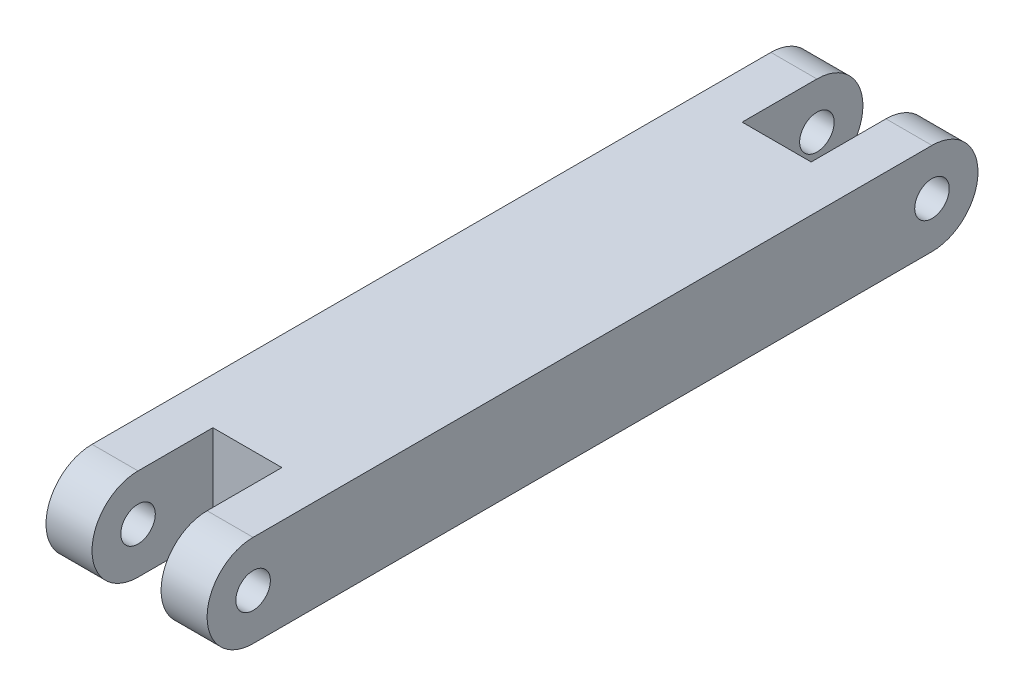
ISO-10303-21;
HEADER;
FILE_DESCRIPTION(('STEP AP214'),'2;1');
FILE_NAME('part.step','',(''),(''),'','','');
FILE_SCHEMA(('AUTOMOTIVE_DESIGN { 1 0 10303 214 1 1 1 1 }'));
ENDSEC;
DATA;
#1=APPLICATION_CONTEXT('core data for automotive mechanical design processes');
#2=APPLICATION_PROTOCOL_DEFINITION('international standard','automotive_design',2000,#1);
#3=PRODUCT_CONTEXT('',#1,'mechanical');
#4=PRODUCT('Part','Part','',(#3));
#5=PRODUCT_RELATED_PRODUCT_CATEGORY('part','',(#4));
#6=PRODUCT_DEFINITION_FORMATION('','',#4);
#7=PRODUCT_DEFINITION_CONTEXT('part definition',#1,'design');
#8=PRODUCT_DEFINITION('design','',#6,#7);
#9=PRODUCT_DEFINITION_SHAPE('','',#8);
#10=(LENGTH_UNIT() NAMED_UNIT(*) SI_UNIT(.MILLI.,.METRE.));
#11=(NAMED_UNIT(*) PLANE_ANGLE_UNIT() SI_UNIT($,.RADIAN.));
#12=(NAMED_UNIT(*) SI_UNIT($,.STERADIAN.) SOLID_ANGLE_UNIT());
#13=UNCERTAINTY_MEASURE_WITH_UNIT(LENGTH_MEASURE(1.E-05),#10,'distance_accuracy_value','');
#14=(GEOMETRIC_REPRESENTATION_CONTEXT(3) GLOBAL_UNCERTAINTY_ASSIGNED_CONTEXT((#13)) GLOBAL_UNIT_ASSIGNED_CONTEXT((#10,
#11,#12)) REPRESENTATION_CONTEXT('',''));
#15=CARTESIAN_POINT('',(0.,0.,0.));
#16=DIRECTION('',(0.,0.,1.));
#17=DIRECTION('',(1.,0.,0.));
#18=AXIS2_PLACEMENT_3D('',#15,#16,#17);
#19=CARTESIAN_POINT('',(4.,0.,29.5));
#20=DIRECTION('',(1.,0.,0.));
#21=DIRECTION('',(0.,0.,-1.));
#22=AXIS2_PLACEMENT_3D('',#19,#20,#21);
#23=PLANE('',#22);
#24=CARTESIAN_POINT('',(4.,0.,-29.5));
#25=DIRECTION('',(1.,0.,0.));
#26=DIRECTION('',(0.,0.,-1.));
#27=AXIS2_PLACEMENT_3D('',#24,#25,#26);
#28=CIRCLE('',#27,1.5);
#29=CARTESIAN_POINT('',(4.,0.,-31.));
#30=VERTEX_POINT('',#29);
#31=EDGE_CURVE('E175',#30,#30,#28,.T.);
#32=ORIENTED_EDGE('',*,*,#31,.F.);
#33=EDGE_LOOP('',(#32));
#34=FACE_BOUND('',#33,.T.);
#35=DIRECTION('',(0.,0.,1.));
#36=VECTOR('',#35,1.);
#37=CARTESIAN_POINT('',(4.,4.00000000000001,29.5));
#38=LINE('',#37,#36);
#39=CARTESIAN_POINT('',(4.,4.00000000000001,-29.5));
#40=VERTEX_POINT('',#39);
#41=CARTESIAN_POINT('',(4.,4.00000000000001,-23.));
#42=VERTEX_POINT('',#41);
#43=EDGE_CURVE('E57',#40,#42,#38,.T.);
#44=ORIENTED_EDGE('',*,*,#43,.T.);
#45=DIRECTION('',(0.,-1.,0.));
#46=VECTOR('',#45,1.);
#47=CARTESIAN_POINT('',(4.,4.00000000000001,-23.));
#48=LINE('',#47,#46);
#49=CARTESIAN_POINT('',(4.,-4.00000000000001,-23.));
#50=VERTEX_POINT('',#49);
#51=EDGE_CURVE('E150',#42,#50,#48,.T.);
#52=ORIENTED_EDGE('',*,*,#51,.T.);
#53=DIRECTION('',(0.,0.,-1.));
#54=VECTOR('',#53,1.);
#55=CARTESIAN_POINT('',(4.,-4.00000000000001,29.5));
#56=LINE('',#55,#54);
#57=CARTESIAN_POINT('',(4.,-4.00000000000001,-29.5));
#58=VERTEX_POINT('',#57);
#59=EDGE_CURVE('E190',#50,#58,#56,.T.);
#60=ORIENTED_EDGE('',*,*,#59,.T.);
#61=CARTESIAN_POINT('',(4.,0.,-29.5));
#62=DIRECTION('',(1.,0.,0.));
#63=DIRECTION('',(0.,0.,-1.));
#64=AXIS2_PLACEMENT_3D('',#61,#62,#63);
#65=CIRCLE('',#64,4.00000000000001);
#66=EDGE_CURVE('E194',#58,#40,#65,.T.);
#67=ORIENTED_EDGE('',*,*,#66,.T.);
#68=EDGE_LOOP('',(#44,#52,#60,#67));
#69=FACE_BOUND('',#68,.T.);
#70=ADVANCED_FACE('F34',(#34,#69),#23,.T.);
#71=DIRECTION('',(0.,-1.,0.));
#72=VECTOR('',#71,1.);
#73=CARTESIAN_POINT('',(4.,4.00000000000001,23.));
#74=LINE('',#73,#72);
#75=CARTESIAN_POINT('',(4.,4.00000000000001,23.));
#76=VERTEX_POINT('',#75);
#77=CARTESIAN_POINT('',(4.,-3.99999999999999,23.));
#78=VERTEX_POINT('',#77);
#79=EDGE_CURVE('E49',#76,#78,#74,.T.);
#80=ORIENTED_EDGE('',*,*,#79,.F.);
#81=CARTESIAN_POINT('',(4.,4.00000000000001,29.5));
#82=VERTEX_POINT('',#81);
#83=EDGE_CURVE('E196',#76,#82,#38,.T.);
#84=ORIENTED_EDGE('',*,*,#83,.T.);
#85=CARTESIAN_POINT('',(4.,0.,29.5));
#86=DIRECTION('',(1.,0.,0.));
#87=DIRECTION('',(0.,0.,-1.));
#88=AXIS2_PLACEMENT_3D('',#85,#86,#87);
#89=CIRCLE('',#88,4.00000000000001);
#90=CARTESIAN_POINT('',(4.,-4.00000000000001,29.5));
#91=VERTEX_POINT('',#90);
#92=EDGE_CURVE('E187',#82,#91,#89,.T.);
#93=ORIENTED_EDGE('',*,*,#92,.T.);
#94=EDGE_CURVE('E192',#91,#78,#56,.T.);
#95=ORIENTED_EDGE('',*,*,#94,.T.);
#96=EDGE_LOOP('',(#80,#84,#93,#95));
#97=FACE_BOUND('',#96,.T.);
#98=CARTESIAN_POINT('',(4.,0.,29.5));
#99=DIRECTION('',(1.,0.,0.));
#100=DIRECTION('',(0.,0.,-1.));
#101=AXIS2_PLACEMENT_3D('',#98,#99,#100);
#102=CIRCLE('',#101,1.5);
#103=CARTESIAN_POINT('',(4.,0.,28.));
#104=VERTEX_POINT('',#103);
#105=EDGE_CURVE('E181',#104,#104,#102,.T.);
#106=ORIENTED_EDGE('',*,*,#105,.F.);
#107=EDGE_LOOP('',(#106));
#108=FACE_BOUND('',#107,.T.);
#109=ADVANCED_FACE('F229',(#97,#108),#23,.T.);
#110=CARTESIAN_POINT('',(0.,0.,29.5));
#111=DIRECTION('',(1.,0.,0.));
#112=DIRECTION('',(0.,0.,-1.));
#113=AXIS2_PLACEMENT_3D('',#110,#111,#112);
#114=PLANE('',#113);
#115=CARTESIAN_POINT('',(0.,0.,29.5));
#116=DIRECTION('',(1.,0.,0.));
#117=DIRECTION('',(0.,0.,-1.));
#118=AXIS2_PLACEMENT_3D('',#115,#116,#117);
#119=CIRCLE('',#118,4.00000000000001);
#120=CARTESIAN_POINT('',(0.,4.00000000000001,29.5));
#121=VERTEX_POINT('',#120);
#122=CARTESIAN_POINT('',(0.,-4.00000000000001,29.5));
#123=VERTEX_POINT('',#122);
#124=EDGE_CURVE('E184',#121,#123,#119,.T.);
#125=ORIENTED_EDGE('',*,*,#124,.F.);
#126=DIRECTION('',(0.,0.,1.));
#127=VECTOR('',#126,1.);
#128=CARTESIAN_POINT('',(0.,4.00000000000001,29.5));
#129=LINE('',#128,#127);
#130=CARTESIAN_POINT('',(0.,4.00000000000001,-29.5));
#131=VERTEX_POINT('',#130);
#132=EDGE_CURVE('E191',#131,#121,#129,.T.);
#133=ORIENTED_EDGE('',*,*,#132,.F.);
#134=CARTESIAN_POINT('',(0.,0.,-29.5));
#135=DIRECTION('',(1.,0.,0.));
#136=DIRECTION('',(0.,0.,-1.));
#137=AXIS2_PLACEMENT_3D('',#134,#135,#136);
#138=CIRCLE('',#137,4.00000000000001);
#139=CARTESIAN_POINT('',(0.,-4.00000000000001,-29.5));
#140=VERTEX_POINT('',#139);
#141=EDGE_CURVE('E203',#140,#131,#138,.T.);
#142=ORIENTED_EDGE('',*,*,#141,.F.);
#143=DIRECTION('',(0.,0.,-1.));
#144=VECTOR('',#143,1.);
#145=CARTESIAN_POINT('',(0.,-4.00000000000001,29.5));
#146=LINE('',#145,#144);
#147=EDGE_CURVE('E201',#123,#140,#146,.T.);
#148=ORIENTED_EDGE('',*,*,#147,.F.);
#149=EDGE_LOOP('',(#125,#133,#142,#148));
#150=FACE_BOUND('',#149,.T.);
#151=CARTESIAN_POINT('',(0.,0.,29.5));
#152=DIRECTION('',(1.,0.,0.));
#153=DIRECTION('',(0.,0.,-1.));
#154=AXIS2_PLACEMENT_3D('',#151,#152,#153);
#155=CIRCLE('',#154,1.5);
#156=CARTESIAN_POINT('',(0.,0.,28.));
#157=VERTEX_POINT('',#156);
#158=EDGE_CURVE('E178',#157,#157,#155,.T.);
#159=ORIENTED_EDGE('',*,*,#158,.T.);
#160=EDGE_LOOP('',(#159));
#161=FACE_BOUND('',#160,.T.);
#162=CARTESIAN_POINT('',(0.,0.,-29.5));
#163=DIRECTION('',(1.,0.,0.));
#164=DIRECTION('',(0.,0.,-1.));
#165=AXIS2_PLACEMENT_3D('',#162,#163,#164);
#166=CIRCLE('',#165,1.5);
#167=CARTESIAN_POINT('',(0.,0.,-31.));
#168=VERTEX_POINT('',#167);
#169=EDGE_CURVE('E168',#168,#168,#166,.T.);
#170=ORIENTED_EDGE('',*,*,#169,.T.);
#171=EDGE_LOOP('',(#170));
#172=FACE_BOUND('',#171,.T.);
#173=ADVANCED_FACE('F221',(#150,#161,#172),#114,.F.);
#174=CARTESIAN_POINT('',(4.,0.,29.5));
#175=DIRECTION('',(-1.,0.,0.));
#176=DIRECTION('',(0.,0.,1.));
#177=AXIS2_PLACEMENT_3D('',#174,#175,#176);
#178=CYLINDRICAL_SURFACE('',#177,4.00000000000001);
#179=ORIENTED_EDGE('',*,*,#124,.T.);
#180=DIRECTION('',(-1.,0.,0.));
#181=VECTOR('',#180,1.);
#182=CARTESIAN_POINT('',(4.,-4.00000000000001,29.5));
#183=LINE('',#182,#181);
#184=EDGE_CURVE('E11',#91,#123,#183,.T.);
#185=ORIENTED_EDGE('',*,*,#184,.F.);
#186=ORIENTED_EDGE('',*,*,#92,.F.);
#187=DIRECTION('',(-1.,0.,0.));
#188=VECTOR('',#187,1.);
#189=CARTESIAN_POINT('',(4.,4.00000000000001,29.5));
#190=LINE('',#189,#188);
#191=EDGE_CURVE('E198',#82,#121,#190,.T.);
#192=ORIENTED_EDGE('',*,*,#191,.T.);
#193=EDGE_LOOP('',(#179,#185,#186,#192));
#194=FACE_BOUND('',#193,.T.);
#195=ADVANCED_FACE('F36',(#194),#178,.T.);
#196=CARTESIAN_POINT('',(4.,-4.00000000000001,29.5));
#197=DIRECTION('',(0.,1.,0.));
#198=DIRECTION('',(0.,0.,1.));
#199=AXIS2_PLACEMENT_3D('',#196,#197,#198);
#200=PLANE('',#199);
#201=ORIENTED_EDGE('',*,*,#147,.T.);
#202=DIRECTION('',(-1.,0.,0.));
#203=VECTOR('',#202,1.);
#204=CARTESIAN_POINT('',(4.,-4.00000000000001,-29.5));
#205=LINE('',#204,#203);
#206=EDGE_CURVE('E42',#58,#140,#205,.T.);
#207=ORIENTED_EDGE('',*,*,#206,.F.);
#208=ORIENTED_EDGE('',*,*,#59,.F.);
#209=DIRECTION('',(1.,0.,0.));
#210=VECTOR('',#209,1.);
#211=CARTESIAN_POINT('',(4.,-3.99999999999999,-23.));
#212=LINE('',#211,#210);
#213=CARTESIAN_POINT('',(10.,-3.99999999999997,-23.));
#214=VERTEX_POINT('',#213);
#215=EDGE_CURVE('E152',#50,#214,#212,.T.);
#216=ORIENTED_EDGE('',*,*,#215,.T.);
#217=DIRECTION('',(0.,0.,-1.));
#218=VECTOR('',#217,1.);
#219=CARTESIAN_POINT('',(10.,-3.99999999999998,29.5));
#220=LINE('',#219,#218);
#221=CARTESIAN_POINT('',(10.,-3.99999999999999,-29.5));
#222=VERTEX_POINT('',#221);
#223=EDGE_CURVE('E241',#214,#222,#220,.T.);
#224=ORIENTED_EDGE('',*,*,#223,.T.);
#225=DIRECTION('',(-1.,0.,0.));
#226=VECTOR('',#225,1.);
#227=CARTESIAN_POINT('',(14.,-3.99999999999998,-29.5));
#228=LINE('',#227,#226);
#229=CARTESIAN_POINT('',(14.,-3.99999999999998,-29.5));
#230=VERTEX_POINT('',#229);
#231=EDGE_CURVE('E131',#230,#222,#228,.T.);
#232=ORIENTED_EDGE('',*,*,#231,.F.);
#233=DIRECTION('',(0.,0.,-1.));
#234=VECTOR('',#233,1.);
#235=CARTESIAN_POINT('',(14.,-3.99999999999998,29.5));
#236=LINE('',#235,#234);
#237=CARTESIAN_POINT('',(14.,-3.99999999999998,29.5));
#238=VERTEX_POINT('',#237);
#239=EDGE_CURVE('E123',#238,#230,#236,.T.);
#240=ORIENTED_EDGE('',*,*,#239,.F.);
#241=DIRECTION('',(-1.,0.,0.));
#242=VECTOR('',#241,1.);
#243=CARTESIAN_POINT('',(14.,-3.99999999999998,29.5));
#244=LINE('',#243,#242);
#245=CARTESIAN_POINT('',(10.,-3.99999999999998,29.5));
#246=VERTEX_POINT('',#245);
#247=EDGE_CURVE('E128',#238,#246,#244,.T.);
#248=ORIENTED_EDGE('',*,*,#247,.T.);
#249=CARTESIAN_POINT('',(10.,-3.99999999999998,23.));
#250=VERTEX_POINT('',#249);
#251=EDGE_CURVE('E238',#246,#250,#220,.T.);
#252=ORIENTED_EDGE('',*,*,#251,.T.);
#253=DIRECTION('',(1.,0.,0.));
#254=VECTOR('',#253,1.);
#255=CARTESIAN_POINT('',(4.,-3.99999999999999,23.));
#256=LINE('',#255,#254);
#257=EDGE_CURVE('E159',#78,#250,#256,.T.);
#258=ORIENTED_EDGE('',*,*,#257,.F.);
#259=ORIENTED_EDGE('',*,*,#94,.F.);
#260=ORIENTED_EDGE('',*,*,#184,.T.);
#261=EDGE_LOOP('',(#201,#207,#208,#216,#224,#232,#240,#248,#252,#258,#259,#260));
#262=FACE_BOUND('',#261,.T.);
#263=ADVANCED_FACE('F125',(#262),#200,.F.);
#264=CARTESIAN_POINT('',(4.,0.,-29.5));
#265=DIRECTION('',(-1.,0.,0.));
#266=DIRECTION('',(0.,0.,1.));
#267=AXIS2_PLACEMENT_3D('',#264,#265,#266);
#268=CYLINDRICAL_SURFACE('',#267,4.00000000000001);
#269=ORIENTED_EDGE('',*,*,#141,.T.);
#270=DIRECTION('',(-1.,0.,0.));
#271=VECTOR('',#270,1.);
#272=CARTESIAN_POINT('',(4.,4.00000000000001,-29.5));
#273=LINE('',#272,#271);
#274=EDGE_CURVE('E208',#40,#131,#273,.T.);
#275=ORIENTED_EDGE('',*,*,#274,.F.);
#276=ORIENTED_EDGE('',*,*,#66,.F.);
#277=ORIENTED_EDGE('',*,*,#206,.T.);
#278=EDGE_LOOP('',(#269,#275,#276,#277));
#279=FACE_BOUND('',#278,.T.);
#280=ADVANCED_FACE('F215',(#279),#268,.T.);
#281=CARTESIAN_POINT('',(4.,4.00000000000001,29.5));
#282=DIRECTION('',(0.,-1.,0.));
#283=DIRECTION('',(0.,0.,-1.));
#284=AXIS2_PLACEMENT_3D('',#281,#282,#283);
#285=PLANE('',#284);
#286=ORIENTED_EDGE('',*,*,#132,.T.);
#287=ORIENTED_EDGE('',*,*,#191,.F.);
#288=ORIENTED_EDGE('',*,*,#83,.F.);
#289=DIRECTION('',(-1.,0.,0.));
#290=VECTOR('',#289,1.);
#291=CARTESIAN_POINT('',(4.,4.00000000000001,23.));
#292=LINE('',#291,#290);
#293=CARTESIAN_POINT('',(10.,4.00000000000001,23.));
#294=VERTEX_POINT('',#293);
#295=EDGE_CURVE('E166',#294,#76,#292,.T.);
#296=ORIENTED_EDGE('',*,*,#295,.F.);
#297=DIRECTION('',(0.,0.,1.));
#298=VECTOR('',#297,1.);
#299=CARTESIAN_POINT('',(10.,3.99999999999999,29.5));
#300=LINE('',#299,#298);
#301=CARTESIAN_POINT('',(10.,3.99999999999999,29.5));
#302=VERTEX_POINT('',#301);
#303=EDGE_CURVE('E239',#294,#302,#300,.T.);
#304=ORIENTED_EDGE('',*,*,#303,.T.);
#305=DIRECTION('',(-1.,0.,0.));
#306=VECTOR('',#305,1.);
#307=CARTESIAN_POINT('',(14.,3.99999999999999,29.5));
#308=LINE('',#307,#306);
#309=CARTESIAN_POINT('',(14.,3.99999999999999,29.5));
#310=VERTEX_POINT('',#309);
#311=EDGE_CURVE('E249',#310,#302,#308,.T.);
#312=ORIENTED_EDGE('',*,*,#311,.F.);
#313=DIRECTION('',(0.,0.,1.));
#314=VECTOR('',#313,1.);
#315=CARTESIAN_POINT('',(14.,3.99999999999999,29.5));
#316=LINE('',#315,#314);
#317=CARTESIAN_POINT('',(14.,4.,-29.5));
#318=VERTEX_POINT('',#317);
#319=EDGE_CURVE('E141',#318,#310,#316,.T.);
#320=ORIENTED_EDGE('',*,*,#319,.F.);
#321=DIRECTION('',(-1.,0.,0.));
#322=VECTOR('',#321,1.);
#323=CARTESIAN_POINT('',(14.,4.,-29.5));
#324=LINE('',#323,#322);
#325=CARTESIAN_POINT('',(10.,4.,-29.5));
#326=VERTEX_POINT('',#325);
#327=EDGE_CURVE('E154',#318,#326,#324,.T.);
#328=ORIENTED_EDGE('',*,*,#327,.T.);
#329=CARTESIAN_POINT('',(10.,4.,-23.));
#330=VERTEX_POINT('',#329);
#331=EDGE_CURVE('E145',#326,#330,#300,.T.);
#332=ORIENTED_EDGE('',*,*,#331,.T.);
#333=DIRECTION('',(-1.,0.,0.));
#334=VECTOR('',#333,1.);
#335=CARTESIAN_POINT('',(4.,4.00000000000001,-23.));
#336=LINE('',#335,#334);
#337=EDGE_CURVE('E160',#330,#42,#336,.T.);
#338=ORIENTED_EDGE('',*,*,#337,.T.);
#339=ORIENTED_EDGE('',*,*,#43,.F.);
#340=ORIENTED_EDGE('',*,*,#274,.T.);
#341=EDGE_LOOP('',(#286,#287,#288,#296,#304,#312,#320,#328,#332,#338,#339,#340));
#342=FACE_BOUND('',#341,.T.);
#343=ADVANCED_FACE('F225',(#342),#285,.F.);
#344=CARTESIAN_POINT('',(4.,0.,29.5));
#345=DIRECTION('',(-1.,0.,0.));
#346=DIRECTION('',(0.,0.,1.));
#347=AXIS2_PLACEMENT_3D('',#344,#345,#346);
#348=CYLINDRICAL_SURFACE('',#347,1.5);
#349=ORIENTED_EDGE('',*,*,#105,.T.);
#350=EDGE_LOOP('',(#349));
#351=FACE_BOUND('',#350,.T.);
#352=ORIENTED_EDGE('',*,*,#158,.F.);
#353=EDGE_LOOP('',(#352));
#354=FACE_BOUND('',#353,.T.);
#355=ADVANCED_FACE('F301',(#351,#354),#348,.F.);
#356=CARTESIAN_POINT('',(4.,0.,-29.5));
#357=DIRECTION('',(-1.,0.,0.));
#358=DIRECTION('',(0.,0.,1.));
#359=AXIS2_PLACEMENT_3D('',#356,#357,#358);
#360=CYLINDRICAL_SURFACE('',#359,1.5);
#361=ORIENTED_EDGE('',*,*,#31,.T.);
#362=EDGE_LOOP('',(#361));
#363=FACE_BOUND('',#362,.T.);
#364=ORIENTED_EDGE('',*,*,#169,.F.);
#365=EDGE_LOOP('',(#364));
#366=FACE_BOUND('',#365,.T.);
#367=ADVANCED_FACE('F350',(#363,#366),#360,.F.);
#368=CARTESIAN_POINT('',(0.,0.,23.));
#369=DIRECTION('',(0.,0.,1.));
#370=DIRECTION('',(1.,0.,0.));
#371=AXIS2_PLACEMENT_3D('',#368,#369,#370);
#372=PLANE('',#371);
#373=ORIENTED_EDGE('',*,*,#79,.T.);
#374=ORIENTED_EDGE('',*,*,#257,.T.);
#375=DIRECTION('',(0.,1.,0.));
#376=VECTOR('',#375,1.);
#377=CARTESIAN_POINT('',(10.,4.00000000000001,23.));
#378=LINE('',#377,#376);
#379=EDGE_CURVE('E163',#250,#294,#378,.T.);
#380=ORIENTED_EDGE('',*,*,#379,.T.);
#381=ORIENTED_EDGE('',*,*,#295,.T.);
#382=EDGE_LOOP('',(#373,#374,#380,#381));
#383=FACE_BOUND('',#382,.T.);
#384=ADVANCED_FACE('F234',(#383),#372,.T.);
#385=CARTESIAN_POINT('',(0.,0.,-23.));
#386=DIRECTION('',(0.,0.,1.));
#387=DIRECTION('',(1.,0.,0.));
#388=AXIS2_PLACEMENT_3D('',#385,#386,#387);
#389=PLANE('',#388);
#390=ORIENTED_EDGE('',*,*,#51,.F.);
#391=ORIENTED_EDGE('',*,*,#337,.F.);
#392=DIRECTION('',(0.,1.,0.));
#393=VECTOR('',#392,1.);
#394=CARTESIAN_POINT('',(10.,4.00000000000001,-23.));
#395=LINE('',#394,#393);
#396=EDGE_CURVE('E172',#214,#330,#395,.T.);
#397=ORIENTED_EDGE('',*,*,#396,.F.);
#398=ORIENTED_EDGE('',*,*,#215,.F.);
#399=EDGE_LOOP('',(#390,#391,#397,#398));
#400=FACE_BOUND('',#399,.T.);
#401=ADVANCED_FACE('F262',(#400),#389,.F.);
#402=CARTESIAN_POINT('',(10.,0.,29.5));
#403=DIRECTION('',(1.,0.,0.));
#404=DIRECTION('',(0.,1.,0.));
#405=AXIS2_PLACEMENT_3D('',#402,#403,#404);
#406=PLANE('',#405);
#407=CARTESIAN_POINT('',(10.,0.,-29.5));
#408=DIRECTION('',(1.,0.,0.));
#409=DIRECTION('',(0.,1.,0.));
#410=AXIS2_PLACEMENT_3D('',#407,#408,#409);
#411=CIRCLE('',#410,1.5);
#412=CARTESIAN_POINT('',(10.,1.5,-29.5));
#413=VERTEX_POINT('',#412);
#414=EDGE_CURVE('E273',#413,#413,#411,.T.);
#415=ORIENTED_EDGE('',*,*,#414,.T.);
#416=EDGE_LOOP('',(#415));
#417=FACE_BOUND('',#416,.T.);
#418=ORIENTED_EDGE('',*,*,#223,.F.);
#419=ORIENTED_EDGE('',*,*,#396,.T.);
#420=ORIENTED_EDGE('',*,*,#331,.F.);
#421=CARTESIAN_POINT('',(10.,0.,-29.5));
#422=DIRECTION('',(1.,0.,0.));
#423=DIRECTION('',(0.,1.,0.));
#424=AXIS2_PLACEMENT_3D('',#421,#422,#423);
#425=CIRCLE('',#424,3.99999999999999);
#426=EDGE_CURVE('E240',#222,#326,#425,.T.);
#427=ORIENTED_EDGE('',*,*,#426,.F.);
#428=EDGE_LOOP('',(#418,#419,#420,#427));
#429=FACE_BOUND('',#428,.T.);
#430=ADVANCED_FACE('F257',(#417,#429),#406,.F.);
#431=CARTESIAN_POINT('',(14.,0.,29.5));
#432=DIRECTION('',(1.,0.,0.));
#433=DIRECTION('',(0.,1.,0.));
#434=AXIS2_PLACEMENT_3D('',#431,#432,#433);
#435=PLANE('',#434);
#436=CARTESIAN_POINT('',(14.,0.,29.5));
#437=DIRECTION('',(1.,0.,0.));
#438=DIRECTION('',(0.,1.,0.));
#439=AXIS2_PLACEMENT_3D('',#436,#437,#438);
#440=CIRCLE('',#439,1.5);
#441=CARTESIAN_POINT('',(14.,1.50000000000001,29.5));
#442=VERTEX_POINT('',#441);
#443=EDGE_CURVE('E269',#442,#442,#440,.T.);
#444=ORIENTED_EDGE('',*,*,#443,.F.);
#445=EDGE_LOOP('',(#444));
#446=FACE_BOUND('',#445,.T.);
#447=CARTESIAN_POINT('',(14.,0.,29.5));
#448=DIRECTION('',(1.,0.,0.));
#449=DIRECTION('',(0.,1.,0.));
#450=AXIS2_PLACEMENT_3D('',#447,#448,#449);
#451=CIRCLE('',#450,3.99999999999999);
#452=EDGE_CURVE('E135',#310,#238,#451,.T.);
#453=ORIENTED_EDGE('',*,*,#452,.T.);
#454=ORIENTED_EDGE('',*,*,#239,.T.);
#455=CARTESIAN_POINT('',(14.,0.,-29.5));
#456=DIRECTION('',(1.,0.,0.));
#457=DIRECTION('',(0.,1.,0.));
#458=AXIS2_PLACEMENT_3D('',#455,#456,#457);
#459=CIRCLE('',#458,3.99999999999999);
#460=EDGE_CURVE('E134',#230,#318,#459,.T.);
#461=ORIENTED_EDGE('',*,*,#460,.T.);
#462=ORIENTED_EDGE('',*,*,#319,.T.);
#463=EDGE_LOOP('',(#453,#454,#461,#462));
#464=FACE_BOUND('',#463,.T.);
#465=CARTESIAN_POINT('',(14.,0.,-29.5));
#466=DIRECTION('',(1.,0.,0.));
#467=DIRECTION('',(0.,1.,0.));
#468=AXIS2_PLACEMENT_3D('',#465,#466,#467);
#469=CIRCLE('',#468,1.5);
#470=CARTESIAN_POINT('',(14.,1.50000000000001,-29.5));
#471=VERTEX_POINT('',#470);
#472=EDGE_CURVE('E270',#471,#471,#469,.T.);
#473=ORIENTED_EDGE('',*,*,#472,.F.);
#474=EDGE_LOOP('',(#473));
#475=FACE_BOUND('',#474,.T.);
#476=ADVANCED_FACE('F138',(#446,#464,#475),#435,.T.);
#477=ORIENTED_EDGE('',*,*,#379,.F.);
#478=ORIENTED_EDGE('',*,*,#251,.F.);
#479=CARTESIAN_POINT('',(10.,0.,29.5));
#480=DIRECTION('',(1.,0.,0.));
#481=DIRECTION('',(0.,1.,0.));
#482=AXIS2_PLACEMENT_3D('',#479,#480,#481);
#483=CIRCLE('',#482,3.99999999999999);
#484=EDGE_CURVE('E149',#302,#246,#483,.T.);
#485=ORIENTED_EDGE('',*,*,#484,.F.);
#486=ORIENTED_EDGE('',*,*,#303,.F.);
#487=EDGE_LOOP('',(#477,#478,#485,#486));
#488=FACE_BOUND('',#487,.T.);
#489=CARTESIAN_POINT('',(10.,0.,29.5));
#490=DIRECTION('',(1.,0.,0.));
#491=DIRECTION('',(0.,1.,0.));
#492=AXIS2_PLACEMENT_3D('',#489,#490,#491);
#493=CIRCLE('',#492,1.5);
#494=CARTESIAN_POINT('',(10.,1.50000000000001,29.5));
#495=VERTEX_POINT('',#494);
#496=EDGE_CURVE('E266',#495,#495,#493,.T.);
#497=ORIENTED_EDGE('',*,*,#496,.T.);
#498=EDGE_LOOP('',(#497));
#499=FACE_BOUND('',#498,.T.);
#500=ADVANCED_FACE('F236',(#488,#499),#406,.F.);
#501=CARTESIAN_POINT('',(14.,0.,29.5));
#502=DIRECTION('',(-1.,0.,0.));
#503=DIRECTION('',(0.,-1.,0.));
#504=AXIS2_PLACEMENT_3D('',#501,#502,#503);
#505=CYLINDRICAL_SURFACE('',#504,3.99999999999999);
#506=ORIENTED_EDGE('',*,*,#484,.T.);
#507=ORIENTED_EDGE('',*,*,#247,.F.);
#508=ORIENTED_EDGE('',*,*,#452,.F.);
#509=ORIENTED_EDGE('',*,*,#311,.T.);
#510=EDGE_LOOP('',(#506,#507,#508,#509));
#511=FACE_BOUND('',#510,.T.);
#512=ADVANCED_FACE('F147',(#511),#505,.T.);
#513=CARTESIAN_POINT('',(14.,0.,-29.5));
#514=DIRECTION('',(-1.,0.,0.));
#515=DIRECTION('',(0.,-1.,0.));
#516=AXIS2_PLACEMENT_3D('',#513,#514,#515);
#517=CYLINDRICAL_SURFACE('',#516,3.99999999999999);
#518=ORIENTED_EDGE('',*,*,#426,.T.);
#519=ORIENTED_EDGE('',*,*,#327,.F.);
#520=ORIENTED_EDGE('',*,*,#460,.F.);
#521=ORIENTED_EDGE('',*,*,#231,.T.);
#522=EDGE_LOOP('',(#518,#519,#520,#521));
#523=FACE_BOUND('',#522,.T.);
#524=ADVANCED_FACE('F263',(#523),#517,.T.);
#525=CARTESIAN_POINT('',(14.,0.,29.5));
#526=DIRECTION('',(-1.,0.,0.));
#527=DIRECTION('',(0.,-1.,0.));
#528=AXIS2_PLACEMENT_3D('',#525,#526,#527);
#529=CYLINDRICAL_SURFACE('',#528,1.5);
#530=ORIENTED_EDGE('',*,*,#443,.T.);
#531=EDGE_LOOP('',(#530));
#532=FACE_BOUND('',#531,.T.);
#533=ORIENTED_EDGE('',*,*,#496,.F.);
#534=EDGE_LOOP('',(#533));
#535=FACE_BOUND('',#534,.T.);
#536=ADVANCED_FACE('F390',(#532,#535),#529,.F.);
#537=CARTESIAN_POINT('',(14.,0.,-29.5));
#538=DIRECTION('',(-1.,0.,0.));
#539=DIRECTION('',(0.,-1.,0.));
#540=AXIS2_PLACEMENT_3D('',#537,#538,#539);
#541=CYLINDRICAL_SURFACE('',#540,1.5);
#542=ORIENTED_EDGE('',*,*,#472,.T.);
#543=EDGE_LOOP('',(#542));
#544=FACE_BOUND('',#543,.T.);
#545=ORIENTED_EDGE('',*,*,#414,.F.);
#546=EDGE_LOOP('',(#545));
#547=FACE_BOUND('',#546,.T.);
#548=ADVANCED_FACE('F279',(#544,#547),#541,.F.);
#549=CLOSED_SHELL('',(#70,#109,#173,#195,#263,#280,#343,#355,#367,#384,#401,#430,#476,#500,#512,
#524,#536,#548));
#550=MANIFOLD_SOLID_BREP('B2',#549);
#551=ADVANCED_BREP_SHAPE_REPRESENTATION('',(#18,#550),#14);
#552=SHAPE_DEFINITION_REPRESENTATION(#9,#551);
ENDSEC;
END-ISO-10303-21;
